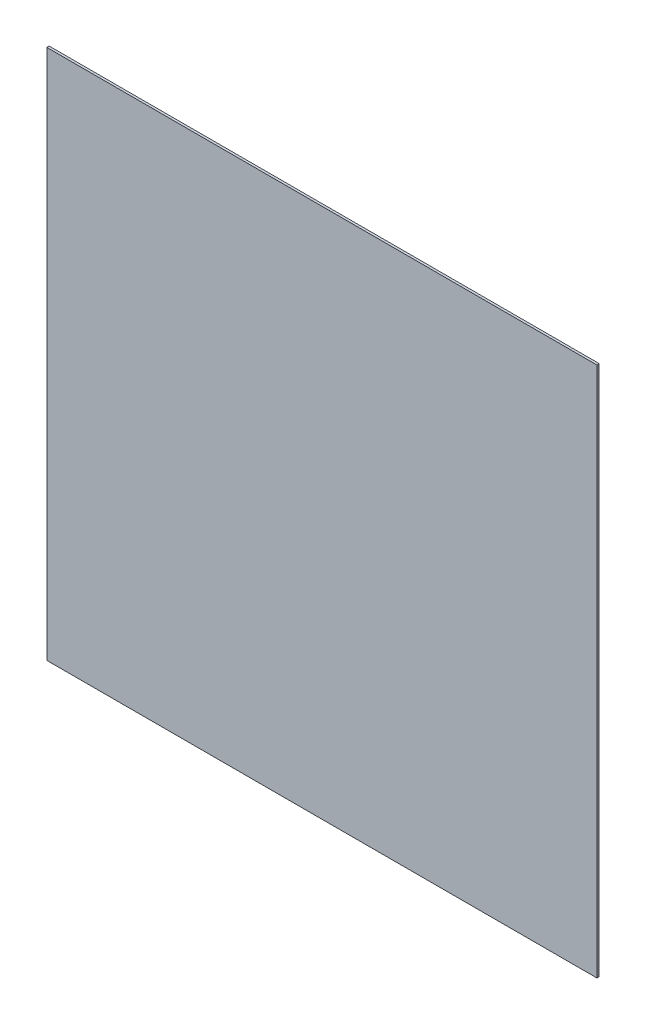
ISO-10303-21;
HEADER;
FILE_DESCRIPTION(('STEP AP214'),'2;1');
FILE_NAME('part.step','',(''),(''),'','','');
FILE_SCHEMA(('AUTOMOTIVE_DESIGN { 1 0 10303 214 1 1 1 1 }'));
ENDSEC;
DATA;
#1=APPLICATION_CONTEXT('core data for automotive mechanical design processes');
#2=APPLICATION_PROTOCOL_DEFINITION('international standard','automotive_design',2000,#1);
#3=PRODUCT_CONTEXT('',#1,'mechanical');
#4=PRODUCT('Part','Part','',(#3));
#5=PRODUCT_RELATED_PRODUCT_CATEGORY('part','',(#4));
#6=PRODUCT_DEFINITION_FORMATION('','',#4);
#7=PRODUCT_DEFINITION_CONTEXT('part definition',#1,'design');
#8=PRODUCT_DEFINITION('design','',#6,#7);
#9=PRODUCT_DEFINITION_SHAPE('','',#8);
#10=(LENGTH_UNIT() NAMED_UNIT(*) SI_UNIT(.MILLI.,.METRE.));
#11=(NAMED_UNIT(*) PLANE_ANGLE_UNIT() SI_UNIT($,.RADIAN.));
#12=(NAMED_UNIT(*) SI_UNIT($,.STERADIAN.) SOLID_ANGLE_UNIT());
#13=UNCERTAINTY_MEASURE_WITH_UNIT(LENGTH_MEASURE(1.E-05),#10,'distance_accuracy_value','');
#14=(GEOMETRIC_REPRESENTATION_CONTEXT(3) GLOBAL_UNCERTAINTY_ASSIGNED_CONTEXT((#13)) GLOBAL_UNIT_ASSIGNED_CONTEXT((#10,
#11,#12)) REPRESENTATION_CONTEXT('',''));
#15=CARTESIAN_POINT('',(0.,0.,0.));
#16=DIRECTION('',(0.,0.,1.));
#17=DIRECTION('',(1.,0.,0.));
#18=AXIS2_PLACEMENT_3D('',#15,#16,#17);
#19=CARTESIAN_POINT('',(10.16,22.278001,1.99616));
#20=DIRECTION('',(0.,0.,1.));
#21=DIRECTION('',(1.,0.,0.));
#22=AXIS2_PLACEMENT_3D('',#19,#20,#21);
#23=PLANE('',#22);
#24=DIRECTION('',(0.,-1.,0.));
#25=VECTOR('',#24,1.);
#26=CARTESIAN_POINT('',(8.159999,22.278001,1.99616));
#27=LINE('',#26,#25);
#28=CARTESIAN_POINT('',(8.160024,24.207976,1.99616));
#29=VERTEX_POINT('',#28);
#30=CARTESIAN_POINT('',(8.160024,20.348026,1.99616));
#31=VERTEX_POINT('',#30);
#32=EDGE_CURVE('E85',#29,#31,#27,.T.);
#33=ORIENTED_EDGE('',*,*,#32,.F.);
#34=DIRECTION('',(-1.,0.,0.));
#35=VECTOR('',#34,1.);
#36=CARTESIAN_POINT('',(10.16,24.208001,1.99616));
#37=LINE('',#36,#35);
#38=CARTESIAN_POINT('',(12.159976,24.207976,1.99616));
#39=VERTEX_POINT('',#38);
#40=EDGE_CURVE('E69',#39,#29,#37,.T.);
#41=ORIENTED_EDGE('',*,*,#40,.F.);
#42=DIRECTION('',(0.,1.,0.));
#43=VECTOR('',#42,1.);
#44=CARTESIAN_POINT('',(12.160001,22.278001,1.99616));
#45=LINE('',#44,#43);
#46=CARTESIAN_POINT('',(12.159976,20.348026,1.99616));
#47=VERTEX_POINT('',#46);
#48=EDGE_CURVE('E68',#47,#39,#45,.T.);
#49=ORIENTED_EDGE('',*,*,#48,.F.);
#50=DIRECTION('',(1.,0.,0.));
#51=VECTOR('',#50,1.);
#52=CARTESIAN_POINT('',(10.16,20.348001,1.99616));
#53=LINE('',#52,#51);
#54=EDGE_CURVE('E54',#31,#47,#53,.T.);
#55=ORIENTED_EDGE('',*,*,#54,.F.);
#56=EDGE_LOOP('',(#33,#41,#49,#55));
#57=FACE_BOUND('',#56,.T.);
#58=ADVANCED_FACE('F17',(#57),#23,.F.);
#59=CARTESIAN_POINT('',(10.16,20.348001,1.99616));
#60=DIRECTION('',(0.,-1.,0.));
#61=DIRECTION('',(1.,0.,0.));
#62=AXIS2_PLACEMENT_3D('',#59,#60,#61);
#63=PLANE('',#62);
#64=ORIENTED_EDGE('',*,*,#54,.T.);
#65=DIRECTION('',(0.,0.,-1.));
#66=VECTOR('',#65,1.);
#67=CARTESIAN_POINT('',(12.160001,20.348001,1.99616));
#68=LINE('',#67,#66);
#69=CARTESIAN_POINT('',(12.159976,20.348026,2.013254));
#70=VERTEX_POINT('',#69);
#71=EDGE_CURVE('E59',#70,#47,#68,.T.);
#72=ORIENTED_EDGE('',*,*,#71,.F.);
#73=DIRECTION('',(1.,0.,0.));
#74=VECTOR('',#73,1.);
#75=CARTESIAN_POINT('',(10.16,20.348001,2.013254));
#76=LINE('',#75,#74);
#77=CARTESIAN_POINT('',(8.160024,20.348026,2.013254));
#78=VERTEX_POINT('',#77);
#79=EDGE_CURVE('E89',#78,#70,#76,.T.);
#80=ORIENTED_EDGE('',*,*,#79,.F.);
#81=DIRECTION('',(0.,0.,1.));
#82=VECTOR('',#81,1.);
#83=CARTESIAN_POINT('',(8.159999,20.348001,1.99616));
#84=LINE('',#83,#82);
#85=EDGE_CURVE('E62',#31,#78,#84,.T.);
#86=ORIENTED_EDGE('',*,*,#85,.F.);
#87=EDGE_LOOP('',(#64,#72,#80,#86));
#88=FACE_BOUND('',#87,.T.);
#89=ADVANCED_FACE('F56',(#88),#63,.T.);
#90=CARTESIAN_POINT('',(12.160001,22.278001,1.99616));
#91=DIRECTION('',(1.,0.,0.));
#92=DIRECTION('',(0.,1.,0.));
#93=AXIS2_PLACEMENT_3D('',#90,#91,#92);
#94=PLANE('',#93);
#95=ORIENTED_EDGE('',*,*,#48,.T.);
#96=DIRECTION('',(0.,0.,-1.));
#97=VECTOR('',#96,1.);
#98=CARTESIAN_POINT('',(12.160001,24.208001,1.99616));
#99=LINE('',#98,#97);
#100=CARTESIAN_POINT('',(12.159976,24.207976,2.013254));
#101=VERTEX_POINT('',#100);
#102=EDGE_CURVE('E72',#101,#39,#99,.T.);
#103=ORIENTED_EDGE('',*,*,#102,.F.);
#104=DIRECTION('',(0.,1.,0.));
#105=VECTOR('',#104,1.);
#106=CARTESIAN_POINT('',(12.160001,22.278001,2.013254));
#107=LINE('',#106,#105);
#108=EDGE_CURVE('E76',#70,#101,#107,.T.);
#109=ORIENTED_EDGE('',*,*,#108,.F.);
#110=ORIENTED_EDGE('',*,*,#71,.T.);
#111=EDGE_LOOP('',(#95,#103,#109,#110));
#112=FACE_BOUND('',#111,.T.);
#113=ADVANCED_FACE('F74',(#112),#94,.T.);
#114=CARTESIAN_POINT('',(10.16,24.208001,1.99616));
#115=DIRECTION('',(0.,1.,0.));
#116=DIRECTION('',(-1.,0.,0.));
#117=AXIS2_PLACEMENT_3D('',#114,#115,#116);
#118=PLANE('',#117);
#119=ORIENTED_EDGE('',*,*,#40,.T.);
#120=DIRECTION('',(0.,0.,-1.));
#121=VECTOR('',#120,1.);
#122=CARTESIAN_POINT('',(8.159999,24.208001,1.99616));
#123=LINE('',#122,#121);
#124=CARTESIAN_POINT('',(8.160024,24.207976,2.013254));
#125=VERTEX_POINT('',#124);
#126=EDGE_CURVE('E35',#125,#29,#123,.T.);
#127=ORIENTED_EDGE('',*,*,#126,.F.);
#128=DIRECTION('',(1.,0.,0.));
#129=VECTOR('',#128,1.);
#130=CARTESIAN_POINT('',(10.16,24.208001,2.013254));
#131=LINE('',#130,#129);
#132=EDGE_CURVE('E26',#101,#125,#131,.F.);
#133=ORIENTED_EDGE('',*,*,#132,.F.);
#134=ORIENTED_EDGE('',*,*,#102,.T.);
#135=EDGE_LOOP('',(#119,#127,#133,#134));
#136=FACE_BOUND('',#135,.T.);
#137=ADVANCED_FACE('F113',(#136),#118,.T.);
#138=CARTESIAN_POINT('',(8.159999,22.278001,1.99616));
#139=DIRECTION('',(-1.,0.,0.));
#140=DIRECTION('',(0.,-1.,0.));
#141=AXIS2_PLACEMENT_3D('',#138,#139,#140);
#142=PLANE('',#141);
#143=ORIENTED_EDGE('',*,*,#32,.T.);
#144=ORIENTED_EDGE('',*,*,#85,.T.);
#145=DIRECTION('',(0.,1.,0.));
#146=VECTOR('',#145,1.);
#147=CARTESIAN_POINT('',(8.159999,22.278001,2.013254));
#148=LINE('',#147,#146);
#149=EDGE_CURVE('E11',#125,#78,#148,.F.);
#150=ORIENTED_EDGE('',*,*,#149,.F.);
#151=ORIENTED_EDGE('',*,*,#126,.T.);
#152=EDGE_LOOP('',(#143,#144,#150,#151));
#153=FACE_BOUND('',#152,.T.);
#154=ADVANCED_FACE('F115',(#153),#142,.T.);
#155=CARTESIAN_POINT('',(10.16,22.278001,2.013254));
#156=DIRECTION('',(0.,0.,1.));
#157=DIRECTION('',(1.,0.,0.));
#158=AXIS2_PLACEMENT_3D('',#155,#156,#157);
#159=PLANE('',#158);
#160=ORIENTED_EDGE('',*,*,#132,.T.);
#161=ORIENTED_EDGE('',*,*,#149,.T.);
#162=ORIENTED_EDGE('',*,*,#79,.T.);
#163=ORIENTED_EDGE('',*,*,#108,.T.);
#164=EDGE_LOOP('',(#160,#161,#162,#163));
#165=FACE_BOUND('',#164,.T.);
#166=ADVANCED_FACE('F112',(#165),#159,.T.);
#167=CLOSED_SHELL('',(#58,#89,#113,#137,#154,#166));
#168=MANIFOLD_SOLID_BREP('B1',#167);
#169=ADVANCED_BREP_SHAPE_REPRESENTATION('',(#18,#168),#14);
#170=SHAPE_DEFINITION_REPRESENTATION(#9,#169);
ENDSEC;
END-ISO-10303-21;
